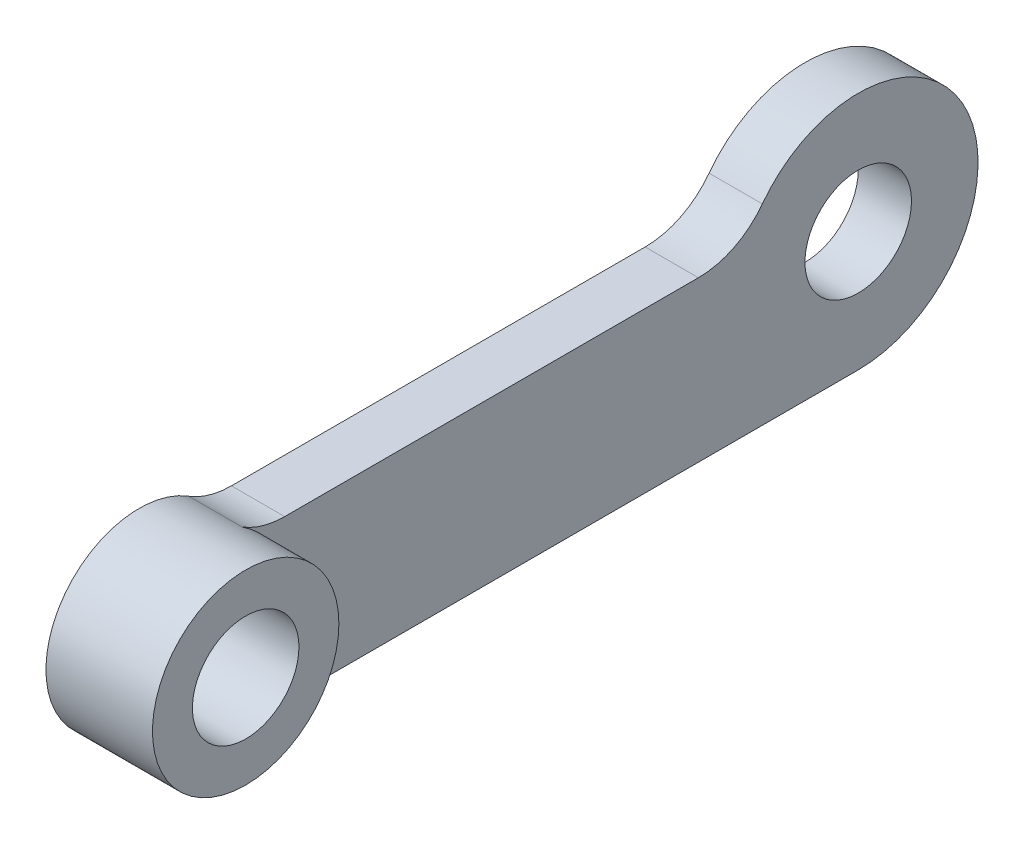
ISO-10303-21;
HEADER;
FILE_DESCRIPTION(('STEP AP214'),'2;1');
FILE_NAME('part.step','',(''),(''),'','','');
FILE_SCHEMA(('AUTOMOTIVE_DESIGN { 1 0 10303 214 1 1 1 1 }'));
ENDSEC;
DATA;
#1=APPLICATION_CONTEXT('core data for automotive mechanical design processes');
#2=APPLICATION_PROTOCOL_DEFINITION('international standard','automotive_design',2000,#1);
#3=PRODUCT_CONTEXT('',#1,'mechanical');
#4=PRODUCT('Part','Part','',(#3));
#5=PRODUCT_RELATED_PRODUCT_CATEGORY('part','',(#4));
#6=PRODUCT_DEFINITION_FORMATION('','',#4);
#7=PRODUCT_DEFINITION_CONTEXT('part definition',#1,'design');
#8=PRODUCT_DEFINITION('design','',#6,#7);
#9=PRODUCT_DEFINITION_SHAPE('','',#8);
#10=(LENGTH_UNIT() NAMED_UNIT(*) SI_UNIT(.MILLI.,.METRE.));
#11=(NAMED_UNIT(*) PLANE_ANGLE_UNIT() SI_UNIT($,.RADIAN.));
#12=(NAMED_UNIT(*) SI_UNIT($,.STERADIAN.) SOLID_ANGLE_UNIT());
#13=UNCERTAINTY_MEASURE_WITH_UNIT(LENGTH_MEASURE(1.E-05),#10,'distance_accuracy_value','');
#14=(GEOMETRIC_REPRESENTATION_CONTEXT(3) GLOBAL_UNCERTAINTY_ASSIGNED_CONTEXT((#13)) GLOBAL_UNIT_ASSIGNED_CONTEXT((#10,
#11,#12)) REPRESENTATION_CONTEXT('',''));
#15=CARTESIAN_POINT('',(0.,0.,0.));
#16=DIRECTION('',(0.,0.,1.));
#17=DIRECTION('',(1.,0.,0.));
#18=AXIS2_PLACEMENT_3D('',#15,#16,#17);
#19=CARTESIAN_POINT('',(2.,-2.5,0.));
#20=DIRECTION('',(1.,0.,0.));
#21=DIRECTION('',(0.,0.,-1.));
#22=AXIS2_PLACEMENT_3D('',#19,#20,#21);
#23=PLANE('',#22);
#24=CARTESIAN_POINT('',(2.,-1.5,-25.));
#25=DIRECTION('',(1.,0.,0.));
#26=DIRECTION('',(0.,0.,-1.));
#27=AXIS2_PLACEMENT_3D('',#24,#25,#26);
#28=CIRCLE('',#27,2.);
#29=CARTESIAN_POINT('',(2.,-1.5,-27.));
#30=VERTEX_POINT('',#29);
#31=EDGE_CURVE('E167',#30,#30,#28,.F.);
#32=ORIENTED_EDGE('',*,*,#31,.T.);
#33=EDGE_LOOP('',(#32));
#34=FACE_BOUND('',#33,.T.);
#35=CARTESIAN_POINT('',(2.,-2.5,0.));
#36=DIRECTION('',(1.,0.,0.));
#37=DIRECTION('',(0.,0.,-1.));
#38=AXIS2_PLACEMENT_3D('',#35,#36,#37);
#39=CIRCLE('',#38,3.5);
#40=CARTESIAN_POINT('',(2.,-6.,0.));
#41=VERTEX_POINT('',#40);
#42=CARTESIAN_POINT('',(2.,0.461538461538461,-1.86528548507418));
#43=VERTEX_POINT('',#42);
#44=EDGE_CURVE('E85',#41,#43,#39,.T.);
#45=ORIENTED_EDGE('',*,*,#44,.F.);
#46=DIRECTION('',(0.,0.,-1.));
#47=VECTOR('',#46,1.);
#48=CARTESIAN_POINT('',(2.,-6.,0.));
#49=LINE('',#48,#47);
#50=CARTESIAN_POINT('',(2.,-6.,-25.));
#51=VERTEX_POINT('',#50);
#52=EDGE_CURVE('E137',#41,#51,#49,.T.);
#53=ORIENTED_EDGE('',*,*,#52,.T.);
#54=CARTESIAN_POINT('',(2.,-1.5,-25.));
#55=DIRECTION('',(1.,0.,0.));
#56=DIRECTION('',(0.,0.,-1.));
#57=AXIS2_PLACEMENT_3D('',#54,#55,#56);
#58=CIRCLE('',#57,4.5);
#59=CARTESIAN_POINT('',(2.,1.2,-21.4));
#60=VERTEX_POINT('',#59);
#61=EDGE_CURVE('E146',#51,#60,#58,.T.);
#62=ORIENTED_EDGE('',*,*,#61,.T.);
#63=CARTESIAN_POINT('',(2.,3.,-19.));
#64=DIRECTION('',(1.,0.,0.));
#65=DIRECTION('',(0.,0.,-1.));
#66=AXIS2_PLACEMENT_3D('',#63,#64,#65);
#67=CIRCLE('',#66,3.);
#68=CARTESIAN_POINT('',(2.,0.,-19.));
#69=VERTEX_POINT('',#68);
#70=EDGE_CURVE('E184',#60,#69,#67,.F.);
#71=ORIENTED_EDGE('',*,*,#70,.T.);
#72=DIRECTION('',(0.,0.,-1.));
#73=VECTOR('',#72,1.);
#74=CARTESIAN_POINT('',(2.,0.,0.));
#75=LINE('',#74,#73);
#76=CARTESIAN_POINT('',(2.,0.,-3.46410161513776));
#77=VERTEX_POINT('',#76);
#78=EDGE_CURVE('E155',#77,#69,#75,.T.);
#79=ORIENTED_EDGE('',*,*,#78,.F.);
#80=CARTESIAN_POINT('',(2.,3.,-3.46410161513776));
#81=DIRECTION('',(1.,0.,0.));
#82=DIRECTION('',(0.,0.,-1.));
#83=AXIS2_PLACEMENT_3D('',#80,#81,#82);
#84=CIRCLE('',#83,3.);
#85=EDGE_CURVE('E12',#77,#43,#84,.F.);
#86=ORIENTED_EDGE('',*,*,#85,.T.);
#87=EDGE_LOOP('',(#45,#53,#62,#71,#79,#86));
#88=FACE_BOUND('',#87,.T.);
#89=ADVANCED_FACE('F69',(#34,#88),#23,.T.);
#90=CARTESIAN_POINT('',(2.,-2.5,0.));
#91=DIRECTION('',(-1.,0.,0.));
#92=DIRECTION('',(0.,0.,1.));
#93=AXIS2_PLACEMENT_3D('',#90,#91,#92);
#94=CYLINDRICAL_SURFACE('',#93,3.5);
#95=ORIENTED_EDGE('',*,*,#44,.T.);
#96=DIRECTION('',(-1.,0.,0.));
#97=VECTOR('',#96,1.);
#98=CARTESIAN_POINT('',(2.,0.461538461538461,-1.86528548507418));
#99=LINE('',#98,#97);
#100=CARTESIAN_POINT('',(0.,0.461538461538461,-1.86528548507418));
#101=VERTEX_POINT('',#100);
#102=EDGE_CURVE('E126',#43,#101,#99,.T.);
#103=ORIENTED_EDGE('',*,*,#102,.T.);
#104=CARTESIAN_POINT('',(0.,-2.5,0.));
#105=DIRECTION('',(1.,0.,0.));
#106=DIRECTION('',(0.,0.,-1.));
#107=AXIS2_PLACEMENT_3D('',#104,#105,#106);
#108=CIRCLE('',#107,3.5);
#109=CARTESIAN_POINT('',(0.,-6.,0.));
#110=VERTEX_POINT('',#109);
#111=EDGE_CURVE('E120',#101,#110,#108,.T.);
#112=ORIENTED_EDGE('',*,*,#111,.T.);
#113=DIRECTION('',(-1.,0.,0.));
#114=VECTOR('',#113,1.);
#115=CARTESIAN_POINT('',(2.,-6.,0.));
#116=LINE('',#115,#114);
#117=EDGE_CURVE('E124',#41,#110,#116,.T.);
#118=ORIENTED_EDGE('',*,*,#117,.F.);
#119=EDGE_LOOP('',(#95,#103,#112,#118));
#120=FACE_BOUND('',#119,.T.);
#121=CARTESIAN_POINT('',(4.,-2.5,0.));
#122=DIRECTION('',(1.,0.,0.));
#123=DIRECTION('',(0.,0.,-1.));
#124=AXIS2_PLACEMENT_3D('',#121,#122,#123);
#125=CIRCLE('',#124,3.5);
#126=CARTESIAN_POINT('',(4.,-2.5,-3.5));
#127=VERTEX_POINT('',#126);
#128=EDGE_CURVE('E162',#127,#127,#125,.T.);
#129=ORIENTED_EDGE('',*,*,#128,.F.);
#130=EDGE_LOOP('',(#129));
#131=FACE_BOUND('',#130,.T.);
#132=ADVANCED_FACE('F122',(#120,#131),#94,.T.);
#133=CARTESIAN_POINT('',(0.,-2.5,0.));
#134=DIRECTION('',(1.,0.,0.));
#135=DIRECTION('',(0.,0.,-1.));
#136=AXIS2_PLACEMENT_3D('',#133,#134,#135);
#137=PLANE('',#136);
#138=CARTESIAN_POINT('',(0.,-2.5,0.));
#139=DIRECTION('',(1.,0.,0.));
#140=DIRECTION('',(0.,0.,-1.));
#141=AXIS2_PLACEMENT_3D('',#138,#139,#140);
#142=CIRCLE('',#141,2.);
#143=CARTESIAN_POINT('',(0.,-2.5,-2.));
#144=VERTEX_POINT('',#143);
#145=EDGE_CURVE('E168',#144,#144,#142,.F.);
#146=ORIENTED_EDGE('',*,*,#145,.F.);
#147=EDGE_LOOP('',(#146));
#148=FACE_BOUND('',#147,.T.);
#149=CARTESIAN_POINT('',(0.,-1.5,-25.));
#150=DIRECTION('',(1.,0.,0.));
#151=DIRECTION('',(0.,0.,-1.));
#152=AXIS2_PLACEMENT_3D('',#149,#150,#151);
#153=CIRCLE('',#152,2.);
#154=CARTESIAN_POINT('',(0.,-1.5,-27.));
#155=VERTEX_POINT('',#154);
#156=EDGE_CURVE('E163',#155,#155,#153,.F.);
#157=ORIENTED_EDGE('',*,*,#156,.F.);
#158=EDGE_LOOP('',(#157));
#159=FACE_BOUND('',#158,.T.);
#160=CARTESIAN_POINT('',(0.,-1.5,-25.));
#161=DIRECTION('',(1.,0.,0.));
#162=DIRECTION('',(0.,0.,-1.));
#163=AXIS2_PLACEMENT_3D('',#160,#161,#162);
#164=CIRCLE('',#163,4.5);
#165=CARTESIAN_POINT('',(0.,-6.,-25.));
#166=VERTEX_POINT('',#165);
#167=CARTESIAN_POINT('',(0.,1.2,-21.4));
#168=VERTEX_POINT('',#167);
#169=EDGE_CURVE('E143',#166,#168,#164,.T.);
#170=ORIENTED_EDGE('',*,*,#169,.F.);
#171=DIRECTION('',(0.,0.,-1.));
#172=VECTOR('',#171,1.);
#173=CARTESIAN_POINT('',(0.,-6.,0.));
#174=LINE('',#173,#172);
#175=EDGE_CURVE('E135',#110,#166,#174,.T.);
#176=ORIENTED_EDGE('',*,*,#175,.F.);
#177=ORIENTED_EDGE('',*,*,#111,.F.);
#178=CARTESIAN_POINT('',(0.,3.,-3.46410161513776));
#179=DIRECTION('',(1.,0.,0.));
#180=DIRECTION('',(0.,0.,-1.));
#181=AXIS2_PLACEMENT_3D('',#178,#179,#180);
#182=CIRCLE('',#181,3.);
#183=CARTESIAN_POINT('',(0.,0.,-3.46410161513776));
#184=VERTEX_POINT('',#183);
#185=EDGE_CURVE('E78',#101,#184,#182,.T.);
#186=ORIENTED_EDGE('',*,*,#185,.T.);
#187=DIRECTION('',(0.,0.,-1.));
#188=VECTOR('',#187,1.);
#189=CARTESIAN_POINT('',(0.,0.,0.));
#190=LINE('',#189,#188);
#191=CARTESIAN_POINT('',(0.,0.,-19.));
#192=VERTEX_POINT('',#191);
#193=EDGE_CURVE('E145',#184,#192,#190,.T.);
#194=ORIENTED_EDGE('',*,*,#193,.T.);
#195=CARTESIAN_POINT('',(0.,3.,-19.));
#196=DIRECTION('',(1.,0.,0.));
#197=DIRECTION('',(0.,0.,-1.));
#198=AXIS2_PLACEMENT_3D('',#195,#196,#197);
#199=CIRCLE('',#198,3.);
#200=EDGE_CURVE('E181',#192,#168,#199,.T.);
#201=ORIENTED_EDGE('',*,*,#200,.T.);
#202=EDGE_LOOP('',(#170,#176,#177,#186,#194,#201));
#203=FACE_BOUND('',#202,.T.);
#204=ADVANCED_FACE('F141',(#148,#159,#203),#137,.F.);
#205=CARTESIAN_POINT('',(2.,-1.5,-25.));
#206=DIRECTION('',(-1.,0.,0.));
#207=DIRECTION('',(0.,0.,1.));
#208=AXIS2_PLACEMENT_3D('',#205,#206,#207);
#209=CYLINDRICAL_SURFACE('',#208,4.5);
#210=ORIENTED_EDGE('',*,*,#169,.T.);
#211=DIRECTION('',(-1.,0.,0.));
#212=VECTOR('',#211,1.);
#213=CARTESIAN_POINT('',(2.,1.2,-21.4));
#214=LINE('',#213,#212);
#215=EDGE_CURVE('E176',#168,#60,#214,.F.);
#216=ORIENTED_EDGE('',*,*,#215,.T.);
#217=ORIENTED_EDGE('',*,*,#61,.F.);
#218=DIRECTION('',(-1.,0.,0.));
#219=VECTOR('',#218,1.);
#220=CARTESIAN_POINT('',(2.,-6.,-25.));
#221=LINE('',#220,#219);
#222=EDGE_CURVE('E130',#51,#166,#221,.T.);
#223=ORIENTED_EDGE('',*,*,#222,.T.);
#224=EDGE_LOOP('',(#210,#216,#217,#223));
#225=FACE_BOUND('',#224,.T.);
#226=ADVANCED_FACE('F229',(#225),#209,.T.);
#227=CARTESIAN_POINT('',(2.,0.,0.));
#228=DIRECTION('',(0.,1.,0.));
#229=DIRECTION('',(0.,0.,1.));
#230=AXIS2_PLACEMENT_3D('',#227,#228,#229);
#231=PLANE('',#230);
#232=ORIENTED_EDGE('',*,*,#78,.T.);
#233=DIRECTION('',(-1.,0.,0.));
#234=VECTOR('',#233,1.);
#235=CARTESIAN_POINT('',(2.,0.,-19.));
#236=LINE('',#235,#234);
#237=EDGE_CURVE('E172',#69,#192,#236,.T.);
#238=ORIENTED_EDGE('',*,*,#237,.T.);
#239=ORIENTED_EDGE('',*,*,#193,.F.);
#240=DIRECTION('',(-1.,0.,0.));
#241=VECTOR('',#240,1.);
#242=CARTESIAN_POINT('',(2.,0.,-3.46410161513776));
#243=LINE('',#242,#241);
#244=EDGE_CURVE('E169',#184,#77,#243,.F.);
#245=ORIENTED_EDGE('',*,*,#244,.T.);
#246=EDGE_LOOP('',(#232,#238,#239,#245));
#247=FACE_BOUND('',#246,.T.);
#248=ADVANCED_FACE('F190',(#247),#231,.T.);
#249=CARTESIAN_POINT('',(2.,-6.,0.));
#250=DIRECTION('',(0.,1.,0.));
#251=DIRECTION('',(0.,0.,1.));
#252=AXIS2_PLACEMENT_3D('',#249,#250,#251);
#253=PLANE('',#252);
#254=ORIENTED_EDGE('',*,*,#175,.T.);
#255=ORIENTED_EDGE('',*,*,#222,.F.);
#256=ORIENTED_EDGE('',*,*,#52,.F.);
#257=ORIENTED_EDGE('',*,*,#117,.T.);
#258=EDGE_LOOP('',(#254,#255,#256,#257));
#259=FACE_BOUND('',#258,.T.);
#260=ADVANCED_FACE('F134',(#259),#253,.F.);
#261=CARTESIAN_POINT('',(4.,-2.5,0.));
#262=DIRECTION('',(1.,0.,0.));
#263=DIRECTION('',(0.,0.,-1.));
#264=AXIS2_PLACEMENT_3D('',#261,#262,#263);
#265=PLANE('',#264);
#266=CARTESIAN_POINT('',(4.,-2.5,0.));
#267=DIRECTION('',(1.,0.,0.));
#268=DIRECTION('',(0.,0.,-1.));
#269=AXIS2_PLACEMENT_3D('',#266,#267,#268);
#270=CIRCLE('',#269,2.);
#271=CARTESIAN_POINT('',(4.,-2.5,-2.));
#272=VERTEX_POINT('',#271);
#273=EDGE_CURVE('E210',#272,#272,#270,.T.);
#274=ORIENTED_EDGE('',*,*,#273,.F.);
#275=EDGE_LOOP('',(#274));
#276=FACE_BOUND('',#275,.T.);
#277=ORIENTED_EDGE('',*,*,#128,.T.);
#278=EDGE_LOOP('',(#277));
#279=FACE_BOUND('',#278,.T.);
#280=ADVANCED_FACE('F218',(#276,#279),#265,.T.);
#281=CARTESIAN_POINT('',(4.,-2.5,0.));
#282=DIRECTION('',(-1.,0.,0.));
#283=DIRECTION('',(0.,0.,1.));
#284=AXIS2_PLACEMENT_3D('',#281,#282,#283);
#285=CYLINDRICAL_SURFACE('',#284,2.);
#286=ORIENTED_EDGE('',*,*,#273,.T.);
#287=EDGE_LOOP('',(#286));
#288=FACE_BOUND('',#287,.T.);
#289=ORIENTED_EDGE('',*,*,#145,.T.);
#290=EDGE_LOOP('',(#289));
#291=FACE_BOUND('',#290,.T.);
#292=ADVANCED_FACE('F215',(#288,#291),#285,.F.);
#293=CARTESIAN_POINT('',(4.,-1.5,-25.));
#294=DIRECTION('',(-1.,0.,0.));
#295=DIRECTION('',(0.,0.,1.));
#296=AXIS2_PLACEMENT_3D('',#293,#294,#295);
#297=CYLINDRICAL_SURFACE('',#296,2.);
#298=ORIENTED_EDGE('',*,*,#31,.F.);
#299=EDGE_LOOP('',(#298));
#300=FACE_BOUND('',#299,.T.);
#301=ORIENTED_EDGE('',*,*,#156,.T.);
#302=EDGE_LOOP('',(#301));
#303=FACE_BOUND('',#302,.T.);
#304=ADVANCED_FACE('F243',(#300,#303),#297,.F.);
#305=CARTESIAN_POINT('',(2.,3.,-19.));
#306=DIRECTION('',(-1.,0.,0.));
#307=DIRECTION('',(0.,0.,1.));
#308=AXIS2_PLACEMENT_3D('',#305,#306,#307);
#309=CYLINDRICAL_SURFACE('',#308,3.);
#310=ORIENTED_EDGE('',*,*,#70,.F.);
#311=ORIENTED_EDGE('',*,*,#215,.F.);
#312=ORIENTED_EDGE('',*,*,#200,.F.);
#313=ORIENTED_EDGE('',*,*,#237,.F.);
#314=EDGE_LOOP('',(#310,#311,#312,#313));
#315=FACE_BOUND('',#314,.T.);
#316=ADVANCED_FACE('F241',(#315),#309,.F.);
#317=CARTESIAN_POINT('',(2.,3.,-3.46410161513776));
#318=DIRECTION('',(-1.,0.,0.));
#319=DIRECTION('',(0.,0.,1.));
#320=AXIS2_PLACEMENT_3D('',#317,#318,#319);
#321=CYLINDRICAL_SURFACE('',#320,3.);
#322=ORIENTED_EDGE('',*,*,#85,.F.);
#323=ORIENTED_EDGE('',*,*,#244,.F.);
#324=ORIENTED_EDGE('',*,*,#185,.F.);
#325=ORIENTED_EDGE('',*,*,#102,.F.);
#326=EDGE_LOOP('',(#322,#323,#324,#325));
#327=FACE_BOUND('',#326,.T.);
#328=ADVANCED_FACE('F71',(#327),#321,.F.);
#329=CLOSED_SHELL('',(#89,#132,#204,#226,#248,#260,#280,#292,#304,#316,#328));
#330=MANIFOLD_SOLID_BREP('B2',#329);
#331=ADVANCED_BREP_SHAPE_REPRESENTATION('',(#18,#330),#14);
#332=SHAPE_DEFINITION_REPRESENTATION(#9,#331);
ENDSEC;
END-ISO-10303-21;
